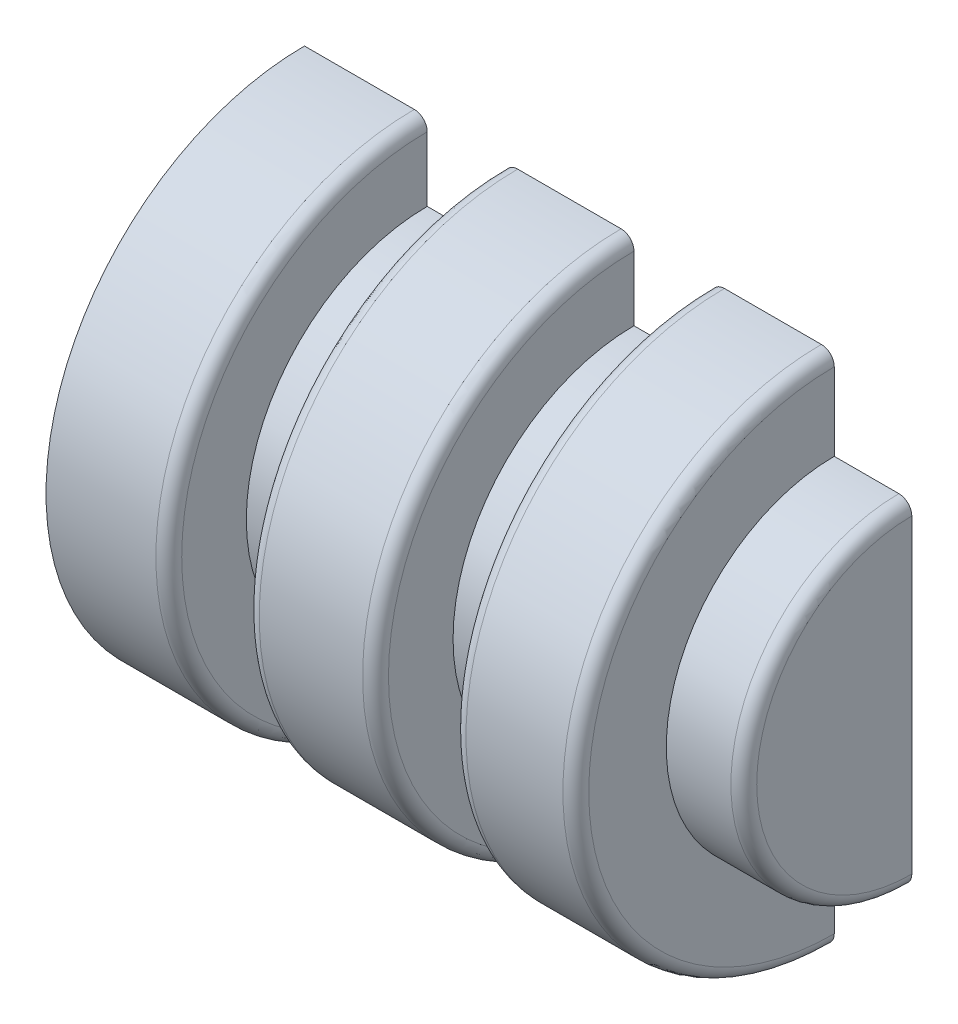
ISO-10303-21;
HEADER;
FILE_DESCRIPTION(('STEP AP214'),'2;1');
FILE_NAME('part.step','',(''),(''),'','','');
FILE_SCHEMA(('AUTOMOTIVE_DESIGN { 1 0 10303 214 1 1 1 1 }'));
ENDSEC;
DATA;
#1=APPLICATION_CONTEXT('core data for automotive mechanical design processes');
#2=APPLICATION_PROTOCOL_DEFINITION('international standard','automotive_design',2000,#1);
#3=PRODUCT_CONTEXT('',#1,'mechanical');
#4=PRODUCT('Part','Part','',(#3));
#5=PRODUCT_RELATED_PRODUCT_CATEGORY('part','',(#4));
#6=PRODUCT_DEFINITION_FORMATION('','',#4);
#7=PRODUCT_DEFINITION_CONTEXT('part definition',#1,'design');
#8=PRODUCT_DEFINITION('design','',#6,#7);
#9=PRODUCT_DEFINITION_SHAPE('','',#8);
#10=(LENGTH_UNIT() NAMED_UNIT(*) SI_UNIT(.MILLI.,.METRE.));
#11=(NAMED_UNIT(*) PLANE_ANGLE_UNIT() SI_UNIT($,.RADIAN.));
#12=(NAMED_UNIT(*) SI_UNIT($,.STERADIAN.) SOLID_ANGLE_UNIT());
#13=UNCERTAINTY_MEASURE_WITH_UNIT(LENGTH_MEASURE(1.E-05),#10,'distance_accuracy_value','');
#14=(GEOMETRIC_REPRESENTATION_CONTEXT(3) GLOBAL_UNCERTAINTY_ASSIGNED_CONTEXT((#13)) GLOBAL_UNIT_ASSIGNED_CONTEXT((#10,
#11,#12)) REPRESENTATION_CONTEXT('',''));
#15=CARTESIAN_POINT('',(0.,0.,0.));
#16=DIRECTION('',(0.,0.,1.));
#17=DIRECTION('',(1.,0.,0.));
#18=AXIS2_PLACEMENT_3D('',#15,#16,#17);
#19=CARTESIAN_POINT('',(-8.,0.,0.));
#20=DIRECTION('',(-1.,0.,0.));
#21=DIRECTION('',(0.,0.,1.));
#22=AXIS2_PLACEMENT_3D('',#19,#20,#21);
#23=PLANE('',#22);
#24=DIRECTION('',(0.,1.,0.));
#25=VECTOR('',#24,1.);
#26=CARTESIAN_POINT('',(-8.,0.,0.));
#27=LINE('',#26,#25);
#28=CARTESIAN_POINT('',(-8.,-9.5,0.));
#29=VERTEX_POINT('',#28);
#30=CARTESIAN_POINT('',(-8.,-7.,0.));
#31=VERTEX_POINT('',#30);
#32=EDGE_CURVE('E238',#29,#31,#27,.T.);
#33=ORIENTED_EDGE('',*,*,#32,.F.);
#34=CARTESIAN_POINT('',(-8.,0.,0.));
#35=DIRECTION('',(-1.,0.,0.));
#36=DIRECTION('',(0.,0.,1.));
#37=AXIS2_PLACEMENT_3D('',#34,#35,#36);
#38=CIRCLE('',#37,9.5);
#39=CARTESIAN_POINT('',(-8.,9.5,0.));
#40=VERTEX_POINT('',#39);
#41=EDGE_CURVE('E287',#29,#40,#38,.T.);
#42=ORIENTED_EDGE('',*,*,#41,.T.);
#43=CARTESIAN_POINT('',(-8.,7.,0.));
#44=VERTEX_POINT('',#43);
#45=EDGE_CURVE('E241',#44,#40,#27,.T.);
#46=ORIENTED_EDGE('',*,*,#45,.F.);
#47=CARTESIAN_POINT('',(-8.,0.,0.));
#48=DIRECTION('',(-1.,0.,0.));
#49=DIRECTION('',(0.,0.,1.));
#50=AXIS2_PLACEMENT_3D('',#47,#48,#49);
#51=CIRCLE('',#50,7.);
#52=EDGE_CURVE('E260',#31,#44,#51,.T.);
#53=ORIENTED_EDGE('',*,*,#52,.F.);
#54=EDGE_LOOP('',(#33,#42,#46,#53));
#55=FACE_BOUND('',#54,.T.);
#56=ADVANCED_FACE('F33',(#55),#23,.T.);
#57=CARTESIAN_POINT('',(0.,0.,0.));
#58=DIRECTION('',(1.,0.,0.));
#59=DIRECTION('',(0.,0.,-1.));
#60=AXIS2_PLACEMENT_3D('',#57,#58,#59);
#61=PLANE('',#60);
#62=CARTESIAN_POINT('',(0.,0.,0.));
#63=DIRECTION('',(1.,0.,0.));
#64=DIRECTION('',(0.,0.,-1.));
#65=AXIS2_PLACEMENT_3D('',#62,#63,#64);
#66=CIRCLE('',#65,9.5);
#67=CARTESIAN_POINT('',(0.,-9.5,0.));
#68=VERTEX_POINT('',#67);
#69=CARTESIAN_POINT('',(0.,9.5,0.));
#70=VERTEX_POINT('',#69);
#71=EDGE_CURVE('E305',#68,#70,#66,.F.);
#72=ORIENTED_EDGE('',*,*,#71,.T.);
#73=DIRECTION('',(0.,-1.,0.));
#74=VECTOR('',#73,1.);
#75=CARTESIAN_POINT('',(0.,0.,0.));
#76=LINE('',#75,#74);
#77=CARTESIAN_POINT('',(0.,7.,0.));
#78=VERTEX_POINT('',#77);
#79=EDGE_CURVE('E216',#70,#78,#76,.T.);
#80=ORIENTED_EDGE('',*,*,#79,.T.);
#81=CARTESIAN_POINT('',(0.,0.,0.));
#82=DIRECTION('',(1.,0.,0.));
#83=DIRECTION('',(0.,0.,-1.));
#84=AXIS2_PLACEMENT_3D('',#81,#82,#83);
#85=CIRCLE('',#84,7.);
#86=CARTESIAN_POINT('',(0.,-7.,0.));
#87=VERTEX_POINT('',#86);
#88=EDGE_CURVE('E272',#87,#78,#85,.F.);
#89=ORIENTED_EDGE('',*,*,#88,.F.);
#90=EDGE_CURVE('E220',#87,#68,#76,.T.);
#91=ORIENTED_EDGE('',*,*,#90,.T.);
#92=EDGE_LOOP('',(#72,#80,#89,#91));
#93=FACE_BOUND('',#92,.T.);
#94=ADVANCED_FACE('F345',(#93),#61,.F.);
#95=CARTESIAN_POINT('',(4.75,0.,0.));
#96=DIRECTION('',(1.,0.,0.));
#97=DIRECTION('',(0.,0.,-1.));
#98=AXIS2_PLACEMENT_3D('',#95,#96,#97);
#99=PLANE('',#98);
#100=DIRECTION('',(0.,-1.,0.));
#101=VECTOR('',#100,1.);
#102=CARTESIAN_POINT('',(4.75,0.,0.));
#103=LINE('',#102,#101);
#104=CARTESIAN_POINT('',(4.75,9.5,0.));
#105=VERTEX_POINT('',#104);
#106=CARTESIAN_POINT('',(4.75,6.5,0.));
#107=VERTEX_POINT('',#106);
#108=EDGE_CURVE('E199',#105,#107,#103,.T.);
#109=ORIENTED_EDGE('',*,*,#108,.F.);
#110=CARTESIAN_POINT('',(4.75,0.,0.));
#111=DIRECTION('',(1.,0.,0.));
#112=DIRECTION('',(0.,0.,-1.));
#113=AXIS2_PLACEMENT_3D('',#110,#111,#112);
#114=CIRCLE('',#113,9.5);
#115=CARTESIAN_POINT('',(4.75,-9.5,0.));
#116=VERTEX_POINT('',#115);
#117=EDGE_CURVE('E308',#105,#116,#114,.T.);
#118=ORIENTED_EDGE('',*,*,#117,.T.);
#119=CARTESIAN_POINT('',(4.75,-6.5,0.));
#120=VERTEX_POINT('',#119);
#121=EDGE_CURVE('E202',#120,#116,#103,.T.);
#122=ORIENTED_EDGE('',*,*,#121,.F.);
#123=CARTESIAN_POINT('',(4.75,0.,0.));
#124=DIRECTION('',(1.,0.,0.));
#125=DIRECTION('',(0.,0.,-1.));
#126=AXIS2_PLACEMENT_3D('',#123,#124,#125);
#127=CIRCLE('',#126,6.5);
#128=EDGE_CURVE('E269',#107,#120,#127,.T.);
#129=ORIENTED_EDGE('',*,*,#128,.F.);
#130=EDGE_LOOP('',(#109,#118,#122,#129));
#131=FACE_BOUND('',#130,.T.);
#132=ADVANCED_FACE('F316',(#131),#99,.T.);
#133=CARTESIAN_POINT('',(4.75,0.,0.));
#134=DIRECTION('',(-1.,0.,0.));
#135=DIRECTION('',(0.,0.,1.));
#136=AXIS2_PLACEMENT_3D('',#133,#134,#135);
#137=CYLINDRICAL_SURFACE('',#136,10.);
#138=CARTESIAN_POINT('',(4.25,0.,0.));
#139=DIRECTION('',(1.,0.,0.));
#140=DIRECTION('',(0.,0.,-1.));
#141=AXIS2_PLACEMENT_3D('',#138,#139,#140);
#142=CIRCLE('',#141,10.);
#143=CARTESIAN_POINT('',(4.25,-10.,0.));
#144=VERTEX_POINT('',#143);
#145=CARTESIAN_POINT('',(4.25,10.,0.));
#146=VERTEX_POINT('',#145);
#147=EDGE_CURVE('E299',#144,#146,#142,.F.);
#148=ORIENTED_EDGE('',*,*,#147,.T.);
#149=DIRECTION('',(-1.,0.,0.));
#150=VECTOR('',#149,1.);
#151=CARTESIAN_POINT('',(-15.75,10.,0.));
#152=LINE('',#151,#150);
#153=CARTESIAN_POINT('',(0.5,10.,0.));
#154=VERTEX_POINT('',#153);
#155=EDGE_CURVE('E55',#146,#154,#152,.T.);
#156=ORIENTED_EDGE('',*,*,#155,.T.);
#157=CARTESIAN_POINT('',(0.5,0.,0.));
#158=DIRECTION('',(1.,0.,0.));
#159=DIRECTION('',(0.,0.,-1.));
#160=AXIS2_PLACEMENT_3D('',#157,#158,#159);
#161=CIRCLE('',#160,10.);
#162=CARTESIAN_POINT('',(0.5,-10.,0.));
#163=VERTEX_POINT('',#162);
#164=EDGE_CURVE('E302',#154,#163,#161,.T.);
#165=ORIENTED_EDGE('',*,*,#164,.T.);
#166=DIRECTION('',(1.,0.,0.));
#167=VECTOR('',#166,1.);
#168=CARTESIAN_POINT('',(-15.75,-10.,0.));
#169=LINE('',#168,#167);
#170=EDGE_CURVE('E190',#163,#144,#169,.T.);
#171=ORIENTED_EDGE('',*,*,#170,.T.);
#172=EDGE_LOOP('',(#148,#156,#165,#171));
#173=FACE_BOUND('',#172,.T.);
#174=ADVANCED_FACE('F322',(#173),#137,.T.);
#175=CARTESIAN_POINT('',(7.75,0.,0.));
#176=DIRECTION('',(-1.,0.,0.));
#177=DIRECTION('',(0.,0.,1.));
#178=AXIS2_PLACEMENT_3D('',#175,#176,#177);
#179=CYLINDRICAL_SURFACE('',#178,6.5);
#180=CARTESIAN_POINT('',(7.25,0.,0.));
#181=DIRECTION('',(1.,0.,0.));
#182=DIRECTION('',(0.,0.,-1.));
#183=AXIS2_PLACEMENT_3D('',#180,#181,#182);
#184=CIRCLE('',#183,6.5);
#185=CARTESIAN_POINT('',(7.25,-6.5,0.));
#186=VERTEX_POINT('',#185);
#187=CARTESIAN_POINT('',(7.25,6.5,0.));
#188=VERTEX_POINT('',#187);
#189=EDGE_CURVE('E278',#186,#188,#184,.F.);
#190=ORIENTED_EDGE('',*,*,#189,.T.);
#191=DIRECTION('',(-1.,0.,0.));
#192=VECTOR('',#191,1.);
#193=CARTESIAN_POINT('',(7.75,6.5,0.));
#194=LINE('',#193,#192);
#195=EDGE_CURVE('E201',#188,#107,#194,.T.);
#196=ORIENTED_EDGE('',*,*,#195,.T.);
#197=ORIENTED_EDGE('',*,*,#128,.T.);
#198=DIRECTION('',(-1.,0.,0.));
#199=VECTOR('',#198,1.);
#200=CARTESIAN_POINT('',(7.75,-6.5,0.));
#201=LINE('',#200,#199);
#202=EDGE_CURVE('E211',#120,#186,#201,.F.);
#203=ORIENTED_EDGE('',*,*,#202,.T.);
#204=EDGE_LOOP('',(#190,#196,#197,#203));
#205=FACE_BOUND('',#204,.T.);
#206=ADVANCED_FACE('F405',(#205),#179,.T.);
#207=CARTESIAN_POINT('',(7.75,0.,0.));
#208=DIRECTION('',(1.,0.,0.));
#209=DIRECTION('',(0.,0.,-1.));
#210=AXIS2_PLACEMENT_3D('',#207,#208,#209);
#211=PLANE('',#210);
#212=DIRECTION('',(0.,-1.,0.));
#213=VECTOR('',#212,1.);
#214=CARTESIAN_POINT('',(7.75,0.,0.));
#215=LINE('',#214,#213);
#216=CARTESIAN_POINT('',(7.75,6.,0.));
#217=VERTEX_POINT('',#216);
#218=CARTESIAN_POINT('',(7.75,-6.,0.));
#219=VERTEX_POINT('',#218);
#220=EDGE_CURVE('E207',#217,#219,#215,.T.);
#221=ORIENTED_EDGE('',*,*,#220,.F.);
#222=CARTESIAN_POINT('',(7.75,0.,0.));
#223=DIRECTION('',(1.,0.,0.));
#224=DIRECTION('',(0.,0.,-1.));
#225=AXIS2_PLACEMENT_3D('',#222,#223,#224);
#226=CIRCLE('',#225,6.);
#227=EDGE_CURVE('E275',#217,#219,#226,.T.);
#228=ORIENTED_EDGE('',*,*,#227,.T.);
#229=EDGE_LOOP('',(#221,#228));
#230=FACE_BOUND('',#229,.T.);
#231=ADVANCED_FACE('F402',(#230),#211,.T.);
#232=CARTESIAN_POINT('',(-3.,0.,0.));
#233=DIRECTION('',(1.,0.,0.));
#234=DIRECTION('',(0.,0.,-1.));
#235=AXIS2_PLACEMENT_3D('',#232,#233,#234);
#236=CYLINDRICAL_SURFACE('',#235,7.);
#237=CARTESIAN_POINT('',(-3.,0.,0.));
#238=DIRECTION('',(-1.,0.,0.));
#239=DIRECTION('',(0.,0.,1.));
#240=AXIS2_PLACEMENT_3D('',#237,#238,#239);
#241=CIRCLE('',#240,7.);
#242=CARTESIAN_POINT('',(-3.,-7.,0.));
#243=VERTEX_POINT('',#242);
#244=CARTESIAN_POINT('',(-3.,7.,0.));
#245=VERTEX_POINT('',#244);
#246=EDGE_CURVE('E264',#243,#245,#241,.T.);
#247=ORIENTED_EDGE('',*,*,#246,.F.);
#248=DIRECTION('',(1.,0.,0.));
#249=VECTOR('',#248,1.);
#250=CARTESIAN_POINT('',(-3.,-7.,0.));
#251=LINE('',#250,#249);
#252=EDGE_CURVE('E231',#243,#87,#251,.T.);
#253=ORIENTED_EDGE('',*,*,#252,.T.);
#254=ORIENTED_EDGE('',*,*,#88,.T.);
#255=DIRECTION('',(1.,0.,0.));
#256=VECTOR('',#255,1.);
#257=CARTESIAN_POINT('',(-3.,7.,0.));
#258=LINE('',#257,#256);
#259=EDGE_CURVE('E219',#78,#245,#258,.F.);
#260=ORIENTED_EDGE('',*,*,#259,.T.);
#261=EDGE_LOOP('',(#247,#253,#254,#260));
#262=FACE_BOUND('',#261,.T.);
#263=ADVANCED_FACE('F341',(#262),#236,.T.);
#264=CARTESIAN_POINT('',(7.25,0.,0.));
#265=DIRECTION('',(1.,0.,0.));
#266=DIRECTION('',(0.,0.,-1.));
#267=AXIS2_PLACEMENT_3D('',#264,#265,#266);
#268=TOROIDAL_SURFACE('',#267,6.,0.5);
#269=CARTESIAN_POINT('',(7.25,-6.,0.));
#270=DIRECTION('',(0.,0.,1.));
#271=DIRECTION('',(1.,0.,0.));
#272=AXIS2_PLACEMENT_3D('',#269,#270,#271);
#273=CIRCLE('',#272,0.5);
#274=EDGE_CURVE('E209',#219,#186,#273,.F.);
#275=ORIENTED_EDGE('',*,*,#274,.F.);
#276=ORIENTED_EDGE('',*,*,#227,.F.);
#277=CARTESIAN_POINT('',(7.25,6.,0.));
#278=DIRECTION('',(0.,0.,1.));
#279=DIRECTION('',(1.,0.,0.));
#280=AXIS2_PLACEMENT_3D('',#277,#278,#279);
#281=CIRCLE('',#280,0.5);
#282=EDGE_CURVE('E205',#188,#217,#281,.F.);
#283=ORIENTED_EDGE('',*,*,#282,.F.);
#284=ORIENTED_EDGE('',*,*,#189,.F.);
#285=EDGE_LOOP('',(#275,#276,#283,#284));
#286=FACE_BOUND('',#285,.T.);
#287=ADVANCED_FACE('F397',(#286),#268,.T.);
#288=CARTESIAN_POINT('',(-3.,0.,0.));
#289=DIRECTION('',(-1.,0.,0.));
#290=DIRECTION('',(0.,0.,1.));
#291=AXIS2_PLACEMENT_3D('',#288,#289,#290);
#292=PLANE('',#291);
#293=CARTESIAN_POINT('',(-3.,0.,0.));
#294=DIRECTION('',(-1.,0.,0.));
#295=DIRECTION('',(0.,0.,1.));
#296=AXIS2_PLACEMENT_3D('',#293,#294,#295);
#297=CIRCLE('',#296,9.5);
#298=CARTESIAN_POINT('',(-3.,9.5,0.));
#299=VERTEX_POINT('',#298);
#300=CARTESIAN_POINT('',(-3.,-9.5,0.));
#301=VERTEX_POINT('',#300);
#302=EDGE_CURVE('E296',#299,#301,#297,.F.);
#303=ORIENTED_EDGE('',*,*,#302,.T.);
#304=DIRECTION('',(0.,1.,0.));
#305=VECTOR('',#304,1.);
#306=CARTESIAN_POINT('',(-3.,0.,0.));
#307=LINE('',#306,#305);
#308=EDGE_CURVE('E227',#301,#243,#307,.T.);
#309=ORIENTED_EDGE('',*,*,#308,.T.);
#310=ORIENTED_EDGE('',*,*,#246,.T.);
#311=EDGE_CURVE('E223',#245,#299,#307,.T.);
#312=ORIENTED_EDGE('',*,*,#311,.T.);
#313=EDGE_LOOP('',(#303,#309,#310,#312));
#314=FACE_BOUND('',#313,.T.);
#315=ADVANCED_FACE('F337',(#314),#292,.F.);
#316=CARTESIAN_POINT('',(-8.,0.,0.));
#317=DIRECTION('',(1.,0.,0.));
#318=DIRECTION('',(0.,0.,-1.));
#319=AXIS2_PLACEMENT_3D('',#316,#317,#318);
#320=CYLINDRICAL_SURFACE('',#319,10.);
#321=CARTESIAN_POINT('',(-7.5,0.,0.));
#322=DIRECTION('',(-1.,0.,0.));
#323=DIRECTION('',(0.,0.,1.));
#324=AXIS2_PLACEMENT_3D('',#321,#322,#323);
#325=CIRCLE('',#324,10.);
#326=CARTESIAN_POINT('',(-7.5,10.,0.));
#327=VERTEX_POINT('',#326);
#328=CARTESIAN_POINT('',(-7.5,-10.,0.));
#329=VERTEX_POINT('',#328);
#330=EDGE_CURVE('E293',#327,#329,#325,.F.);
#331=ORIENTED_EDGE('',*,*,#330,.T.);
#332=CARTESIAN_POINT('',(-3.5,-10.,0.));
#333=VERTEX_POINT('',#332);
#334=EDGE_CURVE('E195',#329,#333,#169,.T.);
#335=ORIENTED_EDGE('',*,*,#334,.T.);
#336=CARTESIAN_POINT('',(-3.5,0.,0.));
#337=DIRECTION('',(-1.,0.,0.));
#338=DIRECTION('',(0.,0.,1.));
#339=AXIS2_PLACEMENT_3D('',#336,#337,#338);
#340=CIRCLE('',#339,10.);
#341=CARTESIAN_POINT('',(-3.5,10.,0.));
#342=VERTEX_POINT('',#341);
#343=EDGE_CURVE('E290',#333,#342,#340,.T.);
#344=ORIENTED_EDGE('',*,*,#343,.T.);
#345=EDGE_CURVE('E198',#342,#327,#152,.T.);
#346=ORIENTED_EDGE('',*,*,#345,.T.);
#347=EDGE_LOOP('',(#331,#335,#344,#346));
#348=FACE_BOUND('',#347,.T.);
#349=ADVANCED_FACE('F327',(#348),#320,.T.);
#350=CARTESIAN_POINT('',(-11.,0.,0.));
#351=DIRECTION('',(1.,0.,0.));
#352=DIRECTION('',(0.,0.,-1.));
#353=AXIS2_PLACEMENT_3D('',#350,#351,#352);
#354=CYLINDRICAL_SURFACE('',#353,7.);
#355=CARTESIAN_POINT('',(-11.,0.,0.));
#356=DIRECTION('',(-1.,0.,0.));
#357=DIRECTION('',(0.,0.,1.));
#358=AXIS2_PLACEMENT_3D('',#355,#356,#357);
#359=CIRCLE('',#358,7.);
#360=CARTESIAN_POINT('',(-11.,-7.,0.));
#361=VERTEX_POINT('',#360);
#362=CARTESIAN_POINT('',(-11.,7.,0.));
#363=VERTEX_POINT('',#362);
#364=EDGE_CURVE('E261',#361,#363,#359,.T.);
#365=ORIENTED_EDGE('',*,*,#364,.F.);
#366=DIRECTION('',(1.,0.,0.));
#367=VECTOR('',#366,1.);
#368=CARTESIAN_POINT('',(-11.,-7.,0.));
#369=LINE('',#368,#367);
#370=EDGE_CURVE('E240',#361,#31,#369,.T.);
#371=ORIENTED_EDGE('',*,*,#370,.T.);
#372=ORIENTED_EDGE('',*,*,#52,.T.);
#373=DIRECTION('',(1.,0.,0.));
#374=VECTOR('',#373,1.);
#375=CARTESIAN_POINT('',(-11.,7.,0.));
#376=LINE('',#375,#374);
#377=EDGE_CURVE('E252',#44,#363,#376,.F.);
#378=ORIENTED_EDGE('',*,*,#377,.T.);
#379=EDGE_LOOP('',(#365,#371,#372,#378));
#380=FACE_BOUND('',#379,.T.);
#381=ADVANCED_FACE('F360',(#380),#354,.T.);
#382=CARTESIAN_POINT('',(-11.,0.,0.));
#383=DIRECTION('',(-1.,0.,0.));
#384=DIRECTION('',(0.,0.,1.));
#385=AXIS2_PLACEMENT_3D('',#382,#383,#384);
#386=PLANE('',#385);
#387=CARTESIAN_POINT('',(-11.,0.,0.));
#388=DIRECTION('',(-1.,0.,0.));
#389=DIRECTION('',(0.,0.,1.));
#390=AXIS2_PLACEMENT_3D('',#387,#388,#389);
#391=CIRCLE('',#390,9.5);
#392=CARTESIAN_POINT('',(-11.,9.5,0.));
#393=VERTEX_POINT('',#392);
#394=CARTESIAN_POINT('',(-11.,-9.5,0.));
#395=VERTEX_POINT('',#394);
#396=EDGE_CURVE('E284',#393,#395,#391,.F.);
#397=ORIENTED_EDGE('',*,*,#396,.T.);
#398=DIRECTION('',(0.,1.,0.));
#399=VECTOR('',#398,1.);
#400=CARTESIAN_POINT('',(-11.,0.,0.));
#401=LINE('',#400,#399);
#402=EDGE_CURVE('E244',#395,#361,#401,.T.);
#403=ORIENTED_EDGE('',*,*,#402,.T.);
#404=ORIENTED_EDGE('',*,*,#364,.T.);
#405=EDGE_CURVE('E248',#363,#393,#401,.T.);
#406=ORIENTED_EDGE('',*,*,#405,.T.);
#407=EDGE_LOOP('',(#397,#403,#404,#406));
#408=FACE_BOUND('',#407,.T.);
#409=ADVANCED_FACE('F363',(#408),#386,.F.);
#410=CARTESIAN_POINT('',(-15.75,0.,0.));
#411=DIRECTION('',(1.,0.,0.));
#412=DIRECTION('',(0.,0.,-1.));
#413=AXIS2_PLACEMENT_3D('',#410,#411,#412);
#414=CYLINDRICAL_SURFACE('',#413,10.);
#415=CARTESIAN_POINT('',(-15.75,0.,0.));
#416=DIRECTION('',(-1.,0.,0.));
#417=DIRECTION('',(0.,0.,1.));
#418=AXIS2_PLACEMENT_3D('',#415,#416,#417);
#419=CIRCLE('',#418,10.);
#420=CARTESIAN_POINT('',(-15.75,-10.,0.));
#421=VERTEX_POINT('',#420);
#422=CARTESIAN_POINT('',(-15.75,10.,0.));
#423=VERTEX_POINT('',#422);
#424=EDGE_CURVE('E257',#421,#423,#419,.T.);
#425=ORIENTED_EDGE('',*,*,#424,.F.);
#426=CARTESIAN_POINT('',(-11.5,-10.,0.));
#427=VERTEX_POINT('',#426);
#428=EDGE_CURVE('E191',#421,#427,#169,.T.);
#429=ORIENTED_EDGE('',*,*,#428,.T.);
#430=CARTESIAN_POINT('',(-11.5,0.,0.));
#431=DIRECTION('',(-1.,0.,0.));
#432=DIRECTION('',(0.,0.,1.));
#433=AXIS2_PLACEMENT_3D('',#430,#431,#432);
#434=CIRCLE('',#433,10.);
#435=CARTESIAN_POINT('',(-11.5,10.,0.));
#436=VERTEX_POINT('',#435);
#437=EDGE_CURVE('E281',#427,#436,#434,.T.);
#438=ORIENTED_EDGE('',*,*,#437,.T.);
#439=EDGE_CURVE('E194',#436,#423,#152,.T.);
#440=ORIENTED_EDGE('',*,*,#439,.T.);
#441=EDGE_LOOP('',(#425,#429,#438,#440));
#442=FACE_BOUND('',#441,.T.);
#443=ADVANCED_FACE('F372',(#442),#414,.T.);
#444=CARTESIAN_POINT('',(-15.75,0.,0.));
#445=DIRECTION('',(-1.,0.,0.));
#446=DIRECTION('',(0.,0.,1.));
#447=AXIS2_PLACEMENT_3D('',#444,#445,#446);
#448=PLANE('',#447);
#449=CARTESIAN_POINT('',(-15.75,0.,0.));
#450=DIRECTION('',(-1.,0.,0.));
#451=DIRECTION('',(0.,0.,1.));
#452=AXIS2_PLACEMENT_3D('',#449,#450,#451);
#453=CIRCLE('',#452,2.75);
#454=CARTESIAN_POINT('',(-15.75,-2.75,0.));
#455=VERTEX_POINT('',#454);
#456=CARTESIAN_POINT('',(-15.75,2.75,0.));
#457=VERTEX_POINT('',#456);
#458=EDGE_CURVE('E175',#455,#457,#453,.T.);
#459=ORIENTED_EDGE('',*,*,#458,.F.);
#460=DIRECTION('',(0.,-1.,0.));
#461=VECTOR('',#460,1.);
#462=CARTESIAN_POINT('',(-15.75,10.,0.));
#463=LINE('',#462,#461);
#464=EDGE_CURVE('E182',#455,#421,#463,.T.);
#465=ORIENTED_EDGE('',*,*,#464,.T.);
#466=ORIENTED_EDGE('',*,*,#424,.T.);
#467=EDGE_CURVE('E184',#423,#457,#463,.T.);
#468=ORIENTED_EDGE('',*,*,#467,.T.);
#469=EDGE_LOOP('',(#459,#465,#466,#468));
#470=FACE_BOUND('',#469,.T.);
#471=ADVANCED_FACE('F374',(#470),#448,.T.);
#472=CARTESIAN_POINT('',(-11.5,0.,0.));
#473=DIRECTION('',(-1.,0.,0.));
#474=DIRECTION('',(0.,0.,1.));
#475=AXIS2_PLACEMENT_3D('',#472,#473,#474);
#476=TOROIDAL_SURFACE('',#475,9.5,0.5);
#477=CARTESIAN_POINT('',(-11.5,9.5,0.));
#478=DIRECTION('',(0.,0.,1.));
#479=DIRECTION('',(1.,0.,0.));
#480=AXIS2_PLACEMENT_3D('',#477,#478,#479);
#481=CIRCLE('',#480,0.5);
#482=EDGE_CURVE('E255',#436,#393,#481,.F.);
#483=ORIENTED_EDGE('',*,*,#482,.F.);
#484=ORIENTED_EDGE('',*,*,#437,.F.);
#485=CARTESIAN_POINT('',(-11.5,-9.5,0.));
#486=DIRECTION('',(0.,0.,1.));
#487=DIRECTION('',(1.,0.,0.));
#488=AXIS2_PLACEMENT_3D('',#485,#486,#487);
#489=CIRCLE('',#488,0.5);
#490=EDGE_CURVE('E247',#395,#427,#489,.F.);
#491=ORIENTED_EDGE('',*,*,#490,.F.);
#492=ORIENTED_EDGE('',*,*,#396,.F.);
#493=EDGE_LOOP('',(#483,#484,#491,#492));
#494=FACE_BOUND('',#493,.T.);
#495=ADVANCED_FACE('F368',(#494),#476,.T.);
#496=CARTESIAN_POINT('',(-7.5,0.,0.));
#497=DIRECTION('',(-1.,0.,0.));
#498=DIRECTION('',(0.,0.,1.));
#499=AXIS2_PLACEMENT_3D('',#496,#497,#498);
#500=TOROIDAL_SURFACE('',#499,9.5,0.5);
#501=CARTESIAN_POINT('',(-7.5,9.5,0.));
#502=DIRECTION('',(0.,0.,1.));
#503=DIRECTION('',(1.,0.,0.));
#504=AXIS2_PLACEMENT_3D('',#501,#502,#503);
#505=CIRCLE('',#504,0.5);
#506=EDGE_CURVE('E250',#40,#327,#505,.F.);
#507=ORIENTED_EDGE('',*,*,#506,.F.);
#508=ORIENTED_EDGE('',*,*,#41,.F.);
#509=CARTESIAN_POINT('',(-7.5,-9.5,0.));
#510=DIRECTION('',(0.,0.,1.));
#511=DIRECTION('',(1.,0.,0.));
#512=AXIS2_PLACEMENT_3D('',#509,#510,#511);
#513=CIRCLE('',#512,0.5);
#514=EDGE_CURVE('E236',#329,#29,#513,.F.);
#515=ORIENTED_EDGE('',*,*,#514,.F.);
#516=ORIENTED_EDGE('',*,*,#330,.F.);
#517=EDGE_LOOP('',(#507,#508,#515,#516));
#518=FACE_BOUND('',#517,.T.);
#519=ADVANCED_FACE('F352',(#518),#500,.T.);
#520=CARTESIAN_POINT('',(-3.5,0.,0.));
#521=DIRECTION('',(-1.,0.,0.));
#522=DIRECTION('',(0.,0.,1.));
#523=AXIS2_PLACEMENT_3D('',#520,#521,#522);
#524=TOROIDAL_SURFACE('',#523,9.5,0.5);
#525=CARTESIAN_POINT('',(-3.5,9.5,0.));
#526=DIRECTION('',(0.,0.,1.));
#527=DIRECTION('',(1.,0.,0.));
#528=AXIS2_PLACEMENT_3D('',#525,#526,#527);
#529=CIRCLE('',#528,0.5);
#530=EDGE_CURVE('E226',#342,#299,#529,.F.);
#531=ORIENTED_EDGE('',*,*,#530,.F.);
#532=ORIENTED_EDGE('',*,*,#343,.F.);
#533=CARTESIAN_POINT('',(-3.5,-9.5,0.));
#534=DIRECTION('',(0.,0.,1.));
#535=DIRECTION('',(1.,0.,0.));
#536=AXIS2_PLACEMENT_3D('',#533,#534,#535);
#537=CIRCLE('',#536,0.5);
#538=EDGE_CURVE('E234',#301,#333,#537,.F.);
#539=ORIENTED_EDGE('',*,*,#538,.F.);
#540=ORIENTED_EDGE('',*,*,#302,.F.);
#541=EDGE_LOOP('',(#531,#532,#539,#540));
#542=FACE_BOUND('',#541,.T.);
#543=ADVANCED_FACE('F334',(#542),#524,.T.);
#544=CARTESIAN_POINT('',(0.5,0.,0.));
#545=DIRECTION('',(1.,0.,0.));
#546=DIRECTION('',(0.,0.,-1.));
#547=AXIS2_PLACEMENT_3D('',#544,#545,#546);
#548=TOROIDAL_SURFACE('',#547,9.5,0.5);
#549=CARTESIAN_POINT('',(0.5,-9.5,0.));
#550=DIRECTION('',(0.,0.,1.));
#551=DIRECTION('',(1.,0.,0.));
#552=AXIS2_PLACEMENT_3D('',#549,#550,#551);
#553=CIRCLE('',#552,0.5);
#554=EDGE_CURVE('E229',#163,#68,#553,.F.);
#555=ORIENTED_EDGE('',*,*,#554,.F.);
#556=ORIENTED_EDGE('',*,*,#164,.F.);
#557=CARTESIAN_POINT('',(0.5,9.5,0.));
#558=DIRECTION('',(0.,0.,1.));
#559=DIRECTION('',(1.,0.,0.));
#560=AXIS2_PLACEMENT_3D('',#557,#558,#559);
#561=CIRCLE('',#560,0.5);
#562=EDGE_CURVE('E214',#70,#154,#561,.F.);
#563=ORIENTED_EDGE('',*,*,#562,.F.);
#564=ORIENTED_EDGE('',*,*,#71,.F.);
#565=EDGE_LOOP('',(#555,#556,#563,#564));
#566=FACE_BOUND('',#565,.T.);
#567=ADVANCED_FACE('F349',(#566),#548,.T.);
#568=CARTESIAN_POINT('',(4.25,0.,0.));
#569=DIRECTION('',(1.,0.,0.));
#570=DIRECTION('',(0.,0.,-1.));
#571=AXIS2_PLACEMENT_3D('',#568,#569,#570);
#572=TOROIDAL_SURFACE('',#571,9.5,0.5);
#573=CARTESIAN_POINT('',(4.25,-9.5,0.));
#574=DIRECTION('',(0.,0.,1.));
#575=DIRECTION('',(1.,0.,0.));
#576=AXIS2_PLACEMENT_3D('',#573,#574,#575);
#577=CIRCLE('',#576,0.5);
#578=EDGE_CURVE('E11',#116,#144,#577,.F.);
#579=ORIENTED_EDGE('',*,*,#578,.F.);
#580=ORIENTED_EDGE('',*,*,#117,.F.);
#581=CARTESIAN_POINT('',(4.25,9.5,0.));
#582=DIRECTION('',(0.,0.,1.));
#583=DIRECTION('',(1.,0.,0.));
#584=AXIS2_PLACEMENT_3D('',#581,#582,#583);
#585=CIRCLE('',#584,0.5);
#586=EDGE_CURVE('E41',#146,#105,#585,.F.);
#587=ORIENTED_EDGE('',*,*,#586,.F.);
#588=ORIENTED_EDGE('',*,*,#147,.F.);
#589=EDGE_LOOP('',(#579,#580,#587,#588));
#590=FACE_BOUND('',#589,.T.);
#591=ADVANCED_FACE('F35',(#590),#572,.T.);
#592=CARTESIAN_POINT('',(0.,0.,0.));
#593=DIRECTION('',(0.,0.,1.));
#594=DIRECTION('',(1.,0.,0.));
#595=AXIS2_PLACEMENT_3D('',#592,#593,#594);
#596=PLANE('',#595);
#597=DIRECTION('',(0.,-1.,0.));
#598=VECTOR('',#597,1.);
#599=CARTESIAN_POINT('',(-10.75,2.75,0.));
#600=LINE('',#599,#598);
#601=CARTESIAN_POINT('',(-10.75,2.75,0.));
#602=VERTEX_POINT('',#601);
#603=CARTESIAN_POINT('',(-10.75,-2.75,0.));
#604=VERTEX_POINT('',#603);
#605=EDGE_CURVE('E174',#602,#604,#600,.T.);
#606=ORIENTED_EDGE('',*,*,#605,.F.);
#607=DIRECTION('',(-1.,0.,0.));
#608=VECTOR('',#607,1.);
#609=CARTESIAN_POINT('',(-10.75,2.75,0.));
#610=LINE('',#609,#608);
#611=EDGE_CURVE('E172',#602,#457,#610,.T.);
#612=ORIENTED_EDGE('',*,*,#611,.T.);
#613=ORIENTED_EDGE('',*,*,#467,.F.);
#614=ORIENTED_EDGE('',*,*,#439,.F.);
#615=ORIENTED_EDGE('',*,*,#482,.T.);
#616=ORIENTED_EDGE('',*,*,#405,.F.);
#617=ORIENTED_EDGE('',*,*,#377,.F.);
#618=ORIENTED_EDGE('',*,*,#45,.T.);
#619=ORIENTED_EDGE('',*,*,#506,.T.);
#620=ORIENTED_EDGE('',*,*,#345,.F.);
#621=ORIENTED_EDGE('',*,*,#530,.T.);
#622=ORIENTED_EDGE('',*,*,#311,.F.);
#623=ORIENTED_EDGE('',*,*,#259,.F.);
#624=ORIENTED_EDGE('',*,*,#79,.F.);
#625=ORIENTED_EDGE('',*,*,#562,.T.);
#626=ORIENTED_EDGE('',*,*,#155,.F.);
#627=ORIENTED_EDGE('',*,*,#586,.T.);
#628=ORIENTED_EDGE('',*,*,#108,.T.);
#629=ORIENTED_EDGE('',*,*,#195,.F.);
#630=ORIENTED_EDGE('',*,*,#282,.T.);
#631=ORIENTED_EDGE('',*,*,#220,.T.);
#632=ORIENTED_EDGE('',*,*,#274,.T.);
#633=ORIENTED_EDGE('',*,*,#202,.F.);
#634=ORIENTED_EDGE('',*,*,#121,.T.);
#635=ORIENTED_EDGE('',*,*,#578,.T.);
#636=ORIENTED_EDGE('',*,*,#170,.F.);
#637=ORIENTED_EDGE('',*,*,#554,.T.);
#638=ORIENTED_EDGE('',*,*,#90,.F.);
#639=ORIENTED_EDGE('',*,*,#252,.F.);
#640=ORIENTED_EDGE('',*,*,#308,.F.);
#641=ORIENTED_EDGE('',*,*,#538,.T.);
#642=ORIENTED_EDGE('',*,*,#334,.F.);
#643=ORIENTED_EDGE('',*,*,#514,.T.);
#644=ORIENTED_EDGE('',*,*,#32,.T.);
#645=ORIENTED_EDGE('',*,*,#370,.F.);
#646=ORIENTED_EDGE('',*,*,#402,.F.);
#647=ORIENTED_EDGE('',*,*,#490,.T.);
#648=ORIENTED_EDGE('',*,*,#428,.F.);
#649=ORIENTED_EDGE('',*,*,#464,.F.);
#650=DIRECTION('',(-1.,0.,0.));
#651=VECTOR('',#650,1.);
#652=CARTESIAN_POINT('',(-10.75,-2.75,0.));
#653=LINE('',#652,#651);
#654=EDGE_CURVE('E169',#604,#455,#653,.T.);
#655=ORIENTED_EDGE('',*,*,#654,.F.);
#656=EDGE_LOOP('',(#606,#612,#613,#614,#615,#616,#617,#618,#619,#620,#621,#622,#623,#624,#625,
#626,#627,#628,#629,#630,#631,#632,#633,#634,#635,#636,#637,#638,#639,#640,#641,#642,#643,#644,
#645,#646,#647,#648,#649,#655));
#657=FACE_BOUND('',#656,.T.);
#658=ADVANCED_FACE('F180',(#657),#596,.F.);
#659=CARTESIAN_POINT('',(-10.75,0.,0.));
#660=DIRECTION('',(-1.,0.,0.));
#661=DIRECTION('',(0.,0.,1.));
#662=AXIS2_PLACEMENT_3D('',#659,#660,#661);
#663=CYLINDRICAL_SURFACE('',#662,2.75);
#664=ORIENTED_EDGE('',*,*,#458,.T.);
#665=ORIENTED_EDGE('',*,*,#611,.F.);
#666=CARTESIAN_POINT('',(-10.75,0.,0.));
#667=DIRECTION('',(-1.,0.,0.));
#668=DIRECTION('',(0.,0.,1.));
#669=AXIS2_PLACEMENT_3D('',#666,#667,#668);
#670=CIRCLE('',#669,2.75);
#671=EDGE_CURVE('E47',#604,#602,#670,.T.);
#672=ORIENTED_EDGE('',*,*,#671,.F.);
#673=ORIENTED_EDGE('',*,*,#654,.T.);
#674=EDGE_LOOP('',(#664,#665,#672,#673));
#675=FACE_BOUND('',#674,.T.);
#676=ADVANCED_FACE('F167',(#675),#663,.F.);
#677=CARTESIAN_POINT('',(-10.75,0.,0.));
#678=DIRECTION('',(-1.,0.,0.));
#679=DIRECTION('',(0.,0.,1.));
#680=AXIS2_PLACEMENT_3D('',#677,#678,#679);
#681=PLANE('',#680);
#682=ORIENTED_EDGE('',*,*,#671,.T.);
#683=ORIENTED_EDGE('',*,*,#605,.T.);
#684=EDGE_LOOP('',(#682,#683));
#685=FACE_BOUND('',#684,.T.);
#686=ADVANCED_FACE('F177',(#685),#681,.T.);
#687=CLOSED_SHELL('',(#56,#94,#132,#174,#206,#231,#263,#287,#315,#349,#381,#409,#443,#471,#495,
#519,#543,#567,#591,#658,#676,#686));
#688=MANIFOLD_SOLID_BREP('B2',#687);
#689=ADVANCED_BREP_SHAPE_REPRESENTATION('',(#18,#688),#14);
#690=SHAPE_DEFINITION_REPRESENTATION(#9,#689);
ENDSEC;
END-ISO-10303-21;
